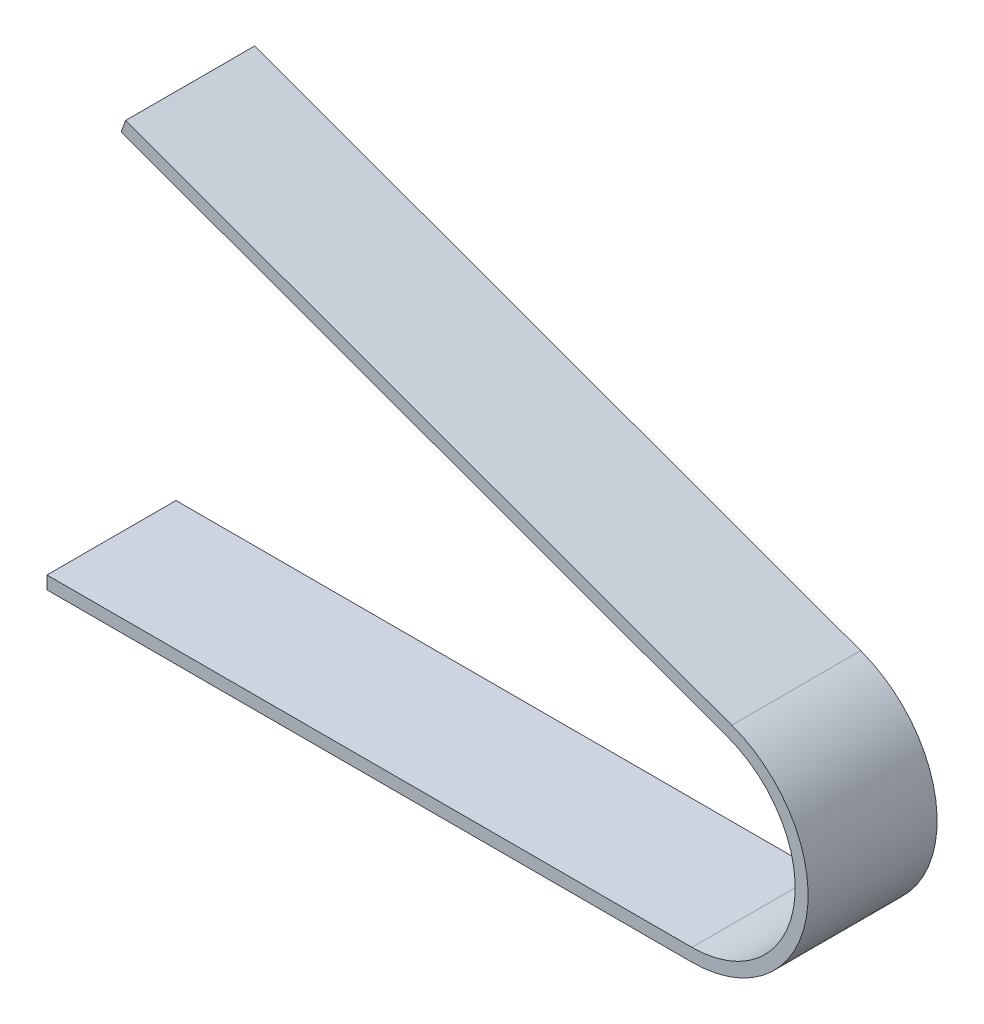
ISO-10303-21;
HEADER;
FILE_DESCRIPTION(('STEP AP214'),'2;1');
FILE_NAME('part.step','',(''),(''),'','','');
FILE_SCHEMA(('AUTOMOTIVE_DESIGN { 1 0 10303 214 1 1 1 1 }'));
ENDSEC;
DATA;
#1=APPLICATION_CONTEXT('core data for automotive mechanical design processes');
#2=APPLICATION_PROTOCOL_DEFINITION('international standard','automotive_design',2000,#1);
#3=PRODUCT_CONTEXT('',#1,'mechanical');
#4=PRODUCT('Part','Part','',(#3));
#5=PRODUCT_RELATED_PRODUCT_CATEGORY('part','',(#4));
#6=PRODUCT_DEFINITION_FORMATION('','',#4);
#7=PRODUCT_DEFINITION_CONTEXT('part definition',#1,'design');
#8=PRODUCT_DEFINITION('design','',#6,#7);
#9=PRODUCT_DEFINITION_SHAPE('','',#8);
#10=(LENGTH_UNIT() NAMED_UNIT(*) SI_UNIT(.MILLI.,.METRE.));
#11=(NAMED_UNIT(*) PLANE_ANGLE_UNIT() SI_UNIT($,.RADIAN.));
#12=(NAMED_UNIT(*) SI_UNIT($,.STERADIAN.) SOLID_ANGLE_UNIT());
#13=UNCERTAINTY_MEASURE_WITH_UNIT(LENGTH_MEASURE(1.E-05),#10,'distance_accuracy_value','');
#14=(GEOMETRIC_REPRESENTATION_CONTEXT(3) GLOBAL_UNCERTAINTY_ASSIGNED_CONTEXT((#13)) GLOBAL_UNIT_ASSIGNED_CONTEXT((#10,
#11,#12)) REPRESENTATION_CONTEXT('',''));
#15=CARTESIAN_POINT('',(0.,0.,0.));
#16=DIRECTION('',(0.,0.,1.));
#17=DIRECTION('',(1.,0.,0.));
#18=AXIS2_PLACEMENT_3D('',#15,#16,#17);
#19=CARTESIAN_POINT('',(3.07818128993102,8.45723358707317,10.));
#20=DIRECTION('',(-0.342020143325669,-0.939692620785908,0.));
#21=DIRECTION('',(0.939692620785908,-0.342020143325669,0.));
#22=AXIS2_PLACEMENT_3D('',#19,#20,#21);
#23=PLANE('',#22);
#24=DIRECTION('',(-0.939692620785908,0.342020143325669,0.));
#25=VECTOR('',#24,1.);
#26=CARTESIAN_POINT('',(3.07818128993102,8.45723358707317,0.));
#27=LINE('',#26,#25);
#28=CARTESIAN_POINT('',(3.07818128993102,8.45723358707317,0.));
#29=VERTEX_POINT('',#28);
#30=CARTESIAN_POINT('',(-43.9064497493644,25.5582407533566,0.));
#31=VERTEX_POINT('',#30);
#32=EDGE_CURVE('E132',#29,#31,#27,.T.);
#33=ORIENTED_EDGE('',*,*,#32,.T.);
#34=DIRECTION('',(0.,0.,-1.));
#35=VECTOR('',#34,1.);
#36=CARTESIAN_POINT('',(-43.9064497493644,25.5582407533566,10.));
#37=LINE('',#36,#35);
#38=CARTESIAN_POINT('',(-43.9064497493644,25.5582407533566,10.));
#39=VERTEX_POINT('',#38);
#40=EDGE_CURVE('E11',#39,#31,#37,.T.);
#41=ORIENTED_EDGE('',*,*,#40,.F.);
#42=DIRECTION('',(-0.939692620785908,0.342020143325669,0.));
#43=VECTOR('',#42,1.);
#44=CARTESIAN_POINT('',(3.07818128993102,8.45723358707317,10.));
#45=LINE('',#44,#43);
#46=CARTESIAN_POINT('',(3.07818128993102,8.45723358707317,10.));
#47=VERTEX_POINT('',#46);
#48=EDGE_CURVE('E90',#47,#39,#45,.T.);
#49=ORIENTED_EDGE('',*,*,#48,.F.);
#50=DIRECTION('',(0.,0.,-1.));
#51=VECTOR('',#50,1.);
#52=CARTESIAN_POINT('',(3.07818128993102,8.45723358707317,10.));
#53=LINE('',#52,#51);
#54=EDGE_CURVE('E131',#47,#29,#53,.T.);
#55=ORIENTED_EDGE('',*,*,#54,.T.);
#56=EDGE_LOOP('',(#33,#41,#49,#55));
#57=FACE_BOUND('',#56,.T.);
#58=ADVANCED_FACE('F35',(#57),#23,.F.);
#59=CARTESIAN_POINT('',(-44.2484698926901,24.6185481325707,10.));
#60=DIRECTION('',(-0.939692620785913,0.342020143325657,0.));
#61=DIRECTION('',(-0.342020143325657,-0.939692620785913,0.));
#62=AXIS2_PLACEMENT_3D('',#59,#60,#61);
#63=PLANE('',#62);
#64=DIRECTION('',(0.342020143325657,0.939692620785913,0.));
#65=VECTOR('',#64,1.);
#66=CARTESIAN_POINT('',(-44.2484698926901,24.6185481325707,0.));
#67=LINE('',#66,#65);
#68=CARTESIAN_POINT('',(-44.2484698926901,24.6185481325707,0.));
#69=VERTEX_POINT('',#68);
#70=EDGE_CURVE('E135',#69,#31,#67,.T.);
#71=ORIENTED_EDGE('',*,*,#70,.F.);
#72=DIRECTION('',(0.,0.,-1.));
#73=VECTOR('',#72,1.);
#74=CARTESIAN_POINT('',(-44.2484698926901,24.6185481325707,10.));
#75=LINE('',#74,#73);
#76=CARTESIAN_POINT('',(-44.2484698926901,24.6185481325707,10.));
#77=VERTEX_POINT('',#76);
#78=EDGE_CURVE('E43',#77,#69,#75,.T.);
#79=ORIENTED_EDGE('',*,*,#78,.F.);
#80=DIRECTION('',(0.342020143325657,0.939692620785913,0.));
#81=VECTOR('',#80,1.);
#82=CARTESIAN_POINT('',(-44.2484698926901,24.6185481325707,10.));
#83=LINE('',#82,#81);
#84=EDGE_CURVE('E174',#77,#39,#83,.T.);
#85=ORIENTED_EDGE('',*,*,#84,.T.);
#86=ORIENTED_EDGE('',*,*,#40,.T.);
#87=EDGE_LOOP('',(#71,#79,#85,#86));
#88=FACE_BOUND('',#87,.T.);
#89=ADVANCED_FACE('F165',(#88),#63,.T.);
#90=CARTESIAN_POINT('',(2.73616114660535,7.51754096628726,10.));
#91=DIRECTION('',(-0.342020143325669,-0.939692620785908,0.));
#92=DIRECTION('',(0.939692620785908,-0.342020143325669,0.));
#93=AXIS2_PLACEMENT_3D('',#90,#91,#92);
#94=PLANE('',#93);
#95=DIRECTION('',(-0.939692620785908,0.342020143325669,0.));
#96=VECTOR('',#95,1.);
#97=CARTESIAN_POINT('',(2.73616114660535,7.51754096628726,0.));
#98=LINE('',#97,#96);
#99=CARTESIAN_POINT('',(2.73616114660535,7.51754096628726,0.));
#100=VERTEX_POINT('',#99);
#101=EDGE_CURVE('E138',#100,#69,#98,.T.);
#102=ORIENTED_EDGE('',*,*,#101,.F.);
#103=DIRECTION('',(0.,0.,-1.));
#104=VECTOR('',#103,1.);
#105=CARTESIAN_POINT('',(2.73616114660535,7.51754096628726,10.));
#106=LINE('',#105,#104);
#107=CARTESIAN_POINT('',(2.73616114660535,7.51754096628726,10.));
#108=VERTEX_POINT('',#107);
#109=EDGE_CURVE('E155',#108,#100,#106,.T.);
#110=ORIENTED_EDGE('',*,*,#109,.F.);
#111=DIRECTION('',(-0.939692620785908,0.342020143325669,0.));
#112=VECTOR('',#111,1.);
#113=CARTESIAN_POINT('',(2.73616114660535,7.51754096628726,10.));
#114=LINE('',#113,#112);
#115=EDGE_CURVE('E162',#108,#77,#114,.T.);
#116=ORIENTED_EDGE('',*,*,#115,.T.);
#117=ORIENTED_EDGE('',*,*,#78,.T.);
#118=EDGE_LOOP('',(#102,#110,#116,#117));
#119=FACE_BOUND('',#118,.T.);
#120=ADVANCED_FACE('F160',(#119),#94,.T.);
#121=CARTESIAN_POINT('',(0.,0.,10.));
#122=DIRECTION('',(0.,0.,-1.));
#123=DIRECTION('',(-1.,0.,0.));
#124=AXIS2_PLACEMENT_3D('',#121,#122,#123);
#125=CYLINDRICAL_SURFACE('',#124,8.);
#126=CARTESIAN_POINT('',(0.,0.,0.));
#127=DIRECTION('',(0.,0.,1.));
#128=DIRECTION('',(-1.,0.,0.));
#129=AXIS2_PLACEMENT_3D('',#126,#127,#128);
#130=CIRCLE('',#129,8.);
#131=CARTESIAN_POINT('',(0.,-8.,0.));
#132=VERTEX_POINT('',#131);
#133=EDGE_CURVE('E141',#132,#100,#130,.T.);
#134=ORIENTED_EDGE('',*,*,#133,.F.);
#135=DIRECTION('',(0.,0.,-1.));
#136=VECTOR('',#135,1.);
#137=CARTESIAN_POINT('',(0.,-8.,10.));
#138=LINE('',#137,#136);
#139=CARTESIAN_POINT('',(0.,-8.,10.));
#140=VERTEX_POINT('',#139);
#141=EDGE_CURVE('E153',#140,#132,#138,.T.);
#142=ORIENTED_EDGE('',*,*,#141,.F.);
#143=CARTESIAN_POINT('',(0.,0.,10.));
#144=DIRECTION('',(0.,0.,1.));
#145=DIRECTION('',(-1.,0.,0.));
#146=AXIS2_PLACEMENT_3D('',#143,#144,#145);
#147=CIRCLE('',#146,8.);
#148=EDGE_CURVE('E126',#140,#108,#147,.T.);
#149=ORIENTED_EDGE('',*,*,#148,.T.);
#150=ORIENTED_EDGE('',*,*,#109,.T.);
#151=EDGE_LOOP('',(#134,#142,#149,#150));
#152=FACE_BOUND('',#151,.T.);
#153=ADVANCED_FACE('F172',(#152),#125,.F.);
#154=CARTESIAN_POINT('',(0.,-8.,10.));
#155=DIRECTION('',(0.,1.,0.));
#156=DIRECTION('',(-1.,0.,0.));
#157=AXIS2_PLACEMENT_3D('',#154,#155,#156);
#158=PLANE('',#157);
#159=DIRECTION('',(1.,0.,0.));
#160=VECTOR('',#159,1.);
#161=CARTESIAN_POINT('',(0.,-8.,0.));
#162=LINE('',#161,#160);
#163=CARTESIAN_POINT('',(-50.,-8.00000000000001,0.));
#164=VERTEX_POINT('',#163);
#165=EDGE_CURVE('E144',#164,#132,#162,.T.);
#166=ORIENTED_EDGE('',*,*,#165,.F.);
#167=DIRECTION('',(0.,0.,-1.));
#168=VECTOR('',#167,1.);
#169=CARTESIAN_POINT('',(-50.,-8.00000000000001,10.));
#170=LINE('',#169,#168);
#171=CARTESIAN_POINT('',(-50.,-8.00000000000001,10.));
#172=VERTEX_POINT('',#171);
#173=EDGE_CURVE('E114',#172,#164,#170,.T.);
#174=ORIENTED_EDGE('',*,*,#173,.F.);
#175=DIRECTION('',(1.,0.,0.));
#176=VECTOR('',#175,1.);
#177=CARTESIAN_POINT('',(0.,-8.,10.));
#178=LINE('',#177,#176);
#179=EDGE_CURVE('E124',#172,#140,#178,.T.);
#180=ORIENTED_EDGE('',*,*,#179,.T.);
#181=ORIENTED_EDGE('',*,*,#141,.T.);
#182=EDGE_LOOP('',(#166,#174,#180,#181));
#183=FACE_BOUND('',#182,.T.);
#184=ADVANCED_FACE('F179',(#183),#158,.T.);
#185=CARTESIAN_POINT('',(-50.,-9.00000000000001,10.));
#186=DIRECTION('',(-1.,0.,0.));
#187=DIRECTION('',(0.,0.,1.));
#188=AXIS2_PLACEMENT_3D('',#185,#186,#187);
#189=PLANE('',#188);
#190=DIRECTION('',(0.,1.,0.));
#191=VECTOR('',#190,1.);
#192=CARTESIAN_POINT('',(-50.,-9.00000000000001,0.));
#193=LINE('',#192,#191);
#194=CARTESIAN_POINT('',(-50.,-9.00000000000001,0.));
#195=VERTEX_POINT('',#194);
#196=EDGE_CURVE('E113',#195,#164,#193,.T.);
#197=ORIENTED_EDGE('',*,*,#196,.F.);
#198=DIRECTION('',(0.,0.,-1.));
#199=VECTOR('',#198,1.);
#200=CARTESIAN_POINT('',(-50.,-9.00000000000001,10.));
#201=LINE('',#200,#199);
#202=CARTESIAN_POINT('',(-50.,-9.00000000000001,10.));
#203=VERTEX_POINT('',#202);
#204=EDGE_CURVE('E107',#203,#195,#201,.T.);
#205=ORIENTED_EDGE('',*,*,#204,.F.);
#206=DIRECTION('',(0.,1.,0.));
#207=VECTOR('',#206,1.);
#208=CARTESIAN_POINT('',(-50.,-9.00000000000001,10.));
#209=LINE('',#208,#207);
#210=EDGE_CURVE('E111',#203,#172,#209,.T.);
#211=ORIENTED_EDGE('',*,*,#210,.T.);
#212=ORIENTED_EDGE('',*,*,#173,.T.);
#213=EDGE_LOOP('',(#197,#205,#211,#212));
#214=FACE_BOUND('',#213,.T.);
#215=ADVANCED_FACE('F109',(#214),#189,.T.);
#216=CARTESIAN_POINT('',(0.,-9.,10.));
#217=DIRECTION('',(0.,1.,0.));
#218=DIRECTION('',(-1.,0.,0.));
#219=AXIS2_PLACEMENT_3D('',#216,#217,#218);
#220=PLANE('',#219);
#221=DIRECTION('',(1.,0.,0.));
#222=VECTOR('',#221,1.);
#223=CARTESIAN_POINT('',(0.,-9.,0.));
#224=LINE('',#223,#222);
#225=CARTESIAN_POINT('',(0.,-9.,0.));
#226=VERTEX_POINT('',#225);
#227=EDGE_CURVE('E78',#195,#226,#224,.T.);
#228=ORIENTED_EDGE('',*,*,#227,.T.);
#229=DIRECTION('',(0.,0.,-1.));
#230=VECTOR('',#229,1.);
#231=CARTESIAN_POINT('',(0.,-9.,10.));
#232=LINE('',#231,#230);
#233=CARTESIAN_POINT('',(0.,-9.,10.));
#234=VERTEX_POINT('',#233);
#235=EDGE_CURVE('E115',#234,#226,#232,.T.);
#236=ORIENTED_EDGE('',*,*,#235,.F.);
#237=DIRECTION('',(1.,0.,0.));
#238=VECTOR('',#237,1.);
#239=CARTESIAN_POINT('',(0.,-9.,10.));
#240=LINE('',#239,#238);
#241=EDGE_CURVE('E117',#203,#234,#240,.T.);
#242=ORIENTED_EDGE('',*,*,#241,.F.);
#243=ORIENTED_EDGE('',*,*,#204,.T.);
#244=EDGE_LOOP('',(#228,#236,#242,#243));
#245=FACE_BOUND('',#244,.T.);
#246=ADVANCED_FACE('F118',(#245),#220,.F.);
#247=CARTESIAN_POINT('',(0.,0.,10.));
#248=DIRECTION('',(0.,0.,-1.));
#249=DIRECTION('',(-1.,0.,0.));
#250=AXIS2_PLACEMENT_3D('',#247,#248,#249);
#251=CYLINDRICAL_SURFACE('',#250,9.);
#252=CARTESIAN_POINT('',(0.,0.,0.));
#253=DIRECTION('',(0.,0.,1.));
#254=DIRECTION('',(1.,0.,0.));
#255=AXIS2_PLACEMENT_3D('',#252,#253,#254);
#256=CIRCLE('',#255,9.);
#257=EDGE_CURVE('E84',#226,#29,#256,.T.);
#258=ORIENTED_EDGE('',*,*,#257,.T.);
#259=ORIENTED_EDGE('',*,*,#54,.F.);
#260=CARTESIAN_POINT('',(0.,0.,10.));
#261=DIRECTION('',(0.,0.,1.));
#262=DIRECTION('',(1.,0.,0.));
#263=AXIS2_PLACEMENT_3D('',#260,#261,#262);
#264=CIRCLE('',#263,9.);
#265=EDGE_CURVE('E51',#234,#47,#264,.T.);
#266=ORIENTED_EDGE('',*,*,#265,.F.);
#267=ORIENTED_EDGE('',*,*,#235,.T.);
#268=EDGE_LOOP('',(#258,#259,#266,#267));
#269=FACE_BOUND('',#268,.T.);
#270=ADVANCED_FACE('F181',(#269),#251,.T.);
#271=CARTESIAN_POINT('',(0.,0.,10.));
#272=DIRECTION('',(0.,0.,1.));
#273=DIRECTION('',(1.,0.,0.));
#274=AXIS2_PLACEMENT_3D('',#271,#272,#273);
#275=PLANE('',#274);
#276=ORIENTED_EDGE('',*,*,#48,.T.);
#277=ORIENTED_EDGE('',*,*,#84,.F.);
#278=ORIENTED_EDGE('',*,*,#115,.F.);
#279=ORIENTED_EDGE('',*,*,#148,.F.);
#280=ORIENTED_EDGE('',*,*,#179,.F.);
#281=ORIENTED_EDGE('',*,*,#210,.F.);
#282=ORIENTED_EDGE('',*,*,#241,.T.);
#283=ORIENTED_EDGE('',*,*,#265,.T.);
#284=EDGE_LOOP('',(#276,#277,#278,#279,#280,#281,#282,#283));
#285=FACE_BOUND('',#284,.T.);
#286=ADVANCED_FACE('F121',(#285),#275,.T.);
#287=CARTESIAN_POINT('',(0.,0.,0.));
#288=DIRECTION('',(0.,0.,1.));
#289=DIRECTION('',(1.,0.,0.));
#290=AXIS2_PLACEMENT_3D('',#287,#288,#289);
#291=PLANE('',#290);
#292=ORIENTED_EDGE('',*,*,#32,.F.);
#293=ORIENTED_EDGE('',*,*,#257,.F.);
#294=ORIENTED_EDGE('',*,*,#227,.F.);
#295=ORIENTED_EDGE('',*,*,#196,.T.);
#296=ORIENTED_EDGE('',*,*,#165,.T.);
#297=ORIENTED_EDGE('',*,*,#133,.T.);
#298=ORIENTED_EDGE('',*,*,#101,.T.);
#299=ORIENTED_EDGE('',*,*,#70,.T.);
#300=EDGE_LOOP('',(#292,#293,#294,#295,#296,#297,#298,#299));
#301=FACE_BOUND('',#300,.T.);
#302=ADVANCED_FACE('F168',(#301),#291,.F.);
#303=CLOSED_SHELL('',(#58,#89,#120,#153,#184,#215,#246,#270,#286,#302));
#304=MANIFOLD_SOLID_BREP('B2',#303);
#305=ADVANCED_BREP_SHAPE_REPRESENTATION('',(#18,#304),#14);
#306=SHAPE_DEFINITION_REPRESENTATION(#9,#305);
ENDSEC;
END-ISO-10303-21;
